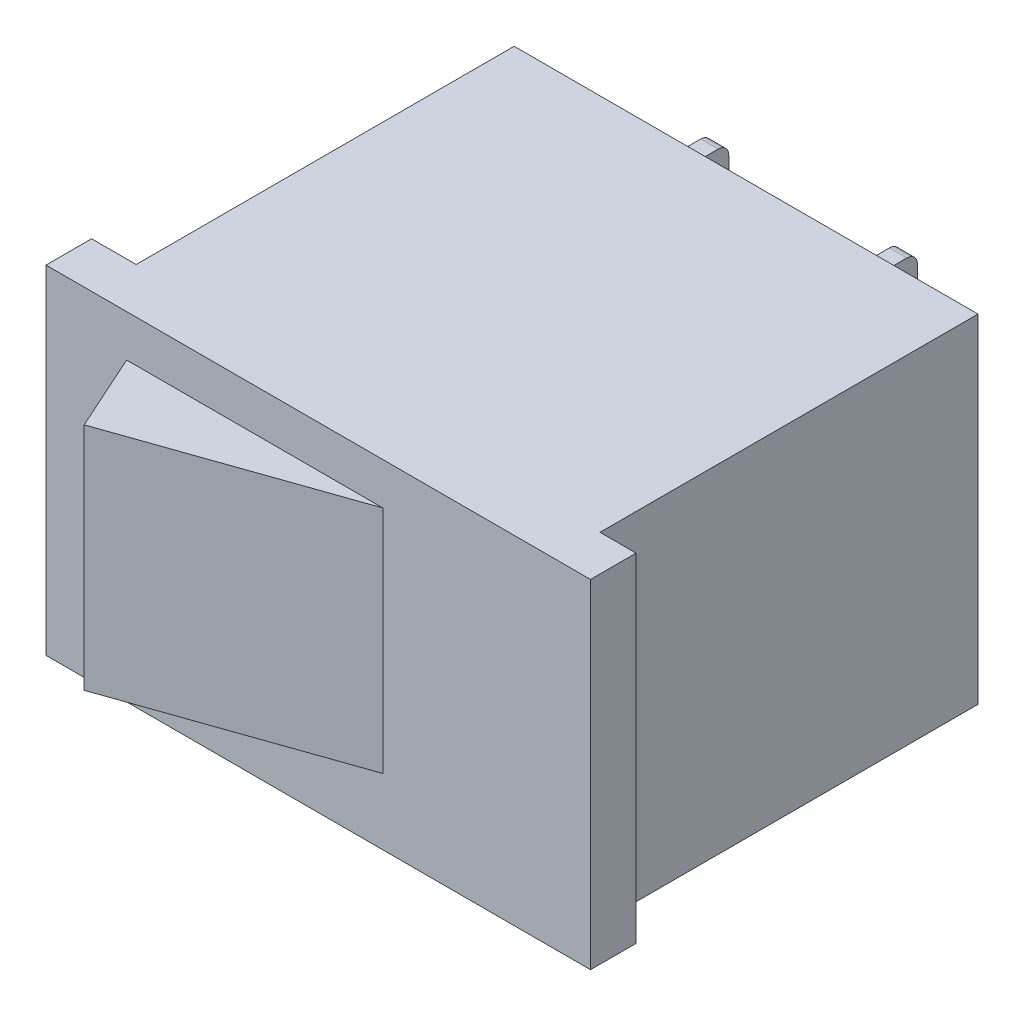
ISO-10303-21;
HEADER;
FILE_DESCRIPTION(('STEP AP214'),'2;1');
FILE_NAME('part.step','',(''),(''),'','','');
FILE_SCHEMA(('AUTOMOTIVE_DESIGN { 1 0 10303 214 1 1 1 1 }'));
ENDSEC;
DATA;
#1=APPLICATION_CONTEXT('core data for automotive mechanical design processes');
#2=APPLICATION_PROTOCOL_DEFINITION('international standard','automotive_design',2000,#1);
#3=PRODUCT_CONTEXT('',#1,'mechanical');
#4=PRODUCT('Part','Part','',(#3));
#5=PRODUCT_RELATED_PRODUCT_CATEGORY('part','',(#4));
#6=PRODUCT_DEFINITION_FORMATION('','',#4);
#7=PRODUCT_DEFINITION_CONTEXT('part definition',#1,'design');
#8=PRODUCT_DEFINITION('design','',#6,#7);
#9=PRODUCT_DEFINITION_SHAPE('','',#8);
#10=(LENGTH_UNIT() NAMED_UNIT(*) SI_UNIT(.MILLI.,.METRE.));
#11=(NAMED_UNIT(*) PLANE_ANGLE_UNIT() SI_UNIT($,.RADIAN.));
#12=(NAMED_UNIT(*) SI_UNIT($,.STERADIAN.) SOLID_ANGLE_UNIT());
#13=UNCERTAINTY_MEASURE_WITH_UNIT(LENGTH_MEASURE(1.E-05),#10,'distance_accuracy_value','');
#14=(GEOMETRIC_REPRESENTATION_CONTEXT(3) GLOBAL_UNCERTAINTY_ASSIGNED_CONTEXT((#13)) GLOBAL_UNIT_ASSIGNED_CONTEXT((#10,
#11,#12)) REPRESENTATION_CONTEXT('',''));
#15=CARTESIAN_POINT('',(0.,0.,0.));
#16=DIRECTION('',(0.,0.,1.));
#17=DIRECTION('',(1.,0.,0.));
#18=AXIS2_PLACEMENT_3D('',#15,#16,#17);
#19=CARTESIAN_POINT('',(152.23999661698,109.43350000042,-5.01892845844));
#20=DIRECTION('',(0.,0.,1.));
#21=DIRECTION('',(0.,-1.,0.));
#22=AXIS2_PLACEMENT_3D('',#19,#20,#21);
#23=PLANE('',#22);
#24=DIRECTION('',(1.,0.,0.));
#25=VECTOR('',#24,1.);
#26=CARTESIAN_POINT('',(163.907021032052,102.351634313093,-5.01892845844));
#27=LINE('',#26,#25);
#28=CARTESIAN_POINT('',(163.907021032052,102.351634313093,-5.01892845844));
#29=VERTEX_POINT('',#28);
#30=CARTESIAN_POINT('',(164.407021032052,102.351634313093,-5.01892845844));
#31=VERTEX_POINT('',#30);
#32=EDGE_CURVE('E342',#29,#31,#27,.T.);
#33=ORIENTED_EDGE('',*,*,#32,.T.);
#34=DIRECTION('',(0.,1.,0.));
#35=VECTOR('',#34,1.);
#36=CARTESIAN_POINT('',(164.407021032052,103.883426971258,-5.01892845844));
#37=LINE('',#36,#35);
#38=CARTESIAN_POINT('',(164.407021032052,103.883426971258,-5.01892845844));
#39=VERTEX_POINT('',#38);
#40=EDGE_CURVE('E340',#31,#39,#37,.T.);
#41=ORIENTED_EDGE('',*,*,#40,.T.);
#42=DIRECTION('',(-1.,0.,0.));
#43=VECTOR('',#42,1.);
#44=CARTESIAN_POINT('',(163.907021032052,103.883426971258,-5.01892845844));
#45=LINE('',#44,#43);
#46=CARTESIAN_POINT('',(163.907021032052,103.883426971258,-5.01892845844));
#47=VERTEX_POINT('',#46);
#48=EDGE_CURVE('E337',#39,#47,#45,.T.);
#49=ORIENTED_EDGE('',*,*,#48,.T.);
#50=DIRECTION('',(0.,-1.,0.));
#51=VECTOR('',#50,1.);
#52=CARTESIAN_POINT('',(163.907021032052,103.883426971258,-5.01892845844));
#53=LINE('',#52,#51);
#54=EDGE_CURVE('E331',#47,#29,#53,.T.);
#55=ORIENTED_EDGE('',*,*,#54,.T.);
#56=EDGE_LOOP('',(#33,#41,#49,#55));
#57=FACE_BOUND('',#56,.T.);
#58=DIRECTION('',(1.,0.,0.));
#59=VECTOR('',#58,1.);
#60=CARTESIAN_POINT('',(195.23999661698,107.740364844211,-5.01892845844));
#61=LINE('',#60,#59);
#62=CARTESIAN_POINT('',(162.795845835652,107.740364844211,-5.01892845844));
#63=VERTEX_POINT('',#62);
#64=CARTESIAN_POINT('',(176.071443274264,107.740364844211,-5.01892845844));
#65=VERTEX_POINT('',#64);
#66=EDGE_CURVE('E368',#63,#65,#61,.T.);
#67=ORIENTED_EDGE('',*,*,#66,.T.);
#68=DIRECTION('',(0.,1.,0.));
#69=VECTOR('',#68,1.);
#70=CARTESIAN_POINT('',(176.071443274264,56.63326000042,-5.01892845844));
#71=LINE('',#70,#69);
#72=CARTESIAN_POINT('',(176.071443274264,98.0658453891069,-5.01892845844));
#73=VERTEX_POINT('',#72);
#74=EDGE_CURVE('E373',#73,#65,#71,.T.);
#75=ORIENTED_EDGE('',*,*,#74,.F.);
#76=DIRECTION('',(-1.,0.,0.));
#77=VECTOR('',#76,1.);
#78=CARTESIAN_POINT('',(195.23999661698,98.0658453891069,-5.01892845844));
#79=LINE('',#78,#77);
#80=CARTESIAN_POINT('',(162.795845835652,98.0658453891069,-5.01892845844));
#81=VERTEX_POINT('',#80);
#82=EDGE_CURVE('E50',#73,#81,#79,.T.);
#83=ORIENTED_EDGE('',*,*,#82,.T.);
#84=DIRECTION('',(0.,1.,0.));
#85=VECTOR('',#84,1.);
#86=CARTESIAN_POINT('',(162.795845835652,56.63326000042,-5.01892845844));
#87=LINE('',#86,#85);
#88=EDGE_CURVE('E11',#81,#63,#87,.T.);
#89=ORIENTED_EDGE('',*,*,#88,.T.);
#90=EDGE_LOOP('',(#67,#75,#83,#89));
#91=FACE_BOUND('',#90,.T.);
#92=DIRECTION('',(-1.,0.,0.));
#93=VECTOR('',#92,1.);
#94=CARTESIAN_POINT('',(169.807021032052,103.883426971258,-5.01892845844));
#95=LINE('',#94,#93);
#96=CARTESIAN_POINT('',(169.807021032052,103.883426971258,-5.01892845844));
#97=VERTEX_POINT('',#96);
#98=CARTESIAN_POINT('',(169.307021032052,103.883426971258,-5.01892845844));
#99=VERTEX_POINT('',#98);
#100=EDGE_CURVE('E62',#97,#99,#95,.T.);
#101=ORIENTED_EDGE('',*,*,#100,.T.);
#102=DIRECTION('',(0.,-1.,0.));
#103=VECTOR('',#102,1.);
#104=CARTESIAN_POINT('',(169.307021032052,103.883426971258,-5.01892845844));
#105=LINE('',#104,#103);
#106=CARTESIAN_POINT('',(169.307021032052,102.351634313093,-5.01892845844));
#107=VERTEX_POINT('',#106);
#108=EDGE_CURVE('E282',#99,#107,#105,.T.);
#109=ORIENTED_EDGE('',*,*,#108,.T.);
#110=DIRECTION('',(1.,0.,0.));
#111=VECTOR('',#110,1.);
#112=CARTESIAN_POINT('',(169.807021032052,102.351634313093,-5.01892845844));
#113=LINE('',#112,#111);
#114=CARTESIAN_POINT('',(169.807021032052,102.351634313093,-5.01892845844));
#115=VERTEX_POINT('',#114);
#116=EDGE_CURVE('E279',#107,#115,#113,.T.);
#117=ORIENTED_EDGE('',*,*,#116,.T.);
#118=DIRECTION('',(0.,1.,0.));
#119=VECTOR('',#118,1.);
#120=CARTESIAN_POINT('',(169.807021032052,103.883426971258,-5.01892845844));
#121=LINE('',#120,#119);
#122=EDGE_CURVE('E58',#115,#97,#121,.T.);
#123=ORIENTED_EDGE('',*,*,#122,.T.);
#124=EDGE_LOOP('',(#101,#109,#117,#123));
#125=FACE_BOUND('',#124,.T.);
#126=ADVANCED_FACE('F42',(#57,#91,#125),#23,.F.);
#127=CARTESIAN_POINT('',(215.443534175473,106.540069400484,10.383601197944));
#128=DIRECTION('',(0.,-1.,0.));
#129=DIRECTION('',(0.,0.,-1.));
#130=AXIS2_PLACEMENT_3D('',#127,#128,#129);
#131=PLANE('',#130);
#132=DIRECTION('',(0.411830588434409,0.,0.911260427336647));
#133=VECTOR('',#132,1.);
#134=CARTESIAN_POINT('',(158.347362330008,106.540069400484,-5.01892845844));
#135=LINE('',#134,#133);
#136=CARTESIAN_POINT('',(163.826190711484,106.540069400484,7.10411347292398));
#137=VERTEX_POINT('',#136);
#138=CARTESIAN_POINT('',(164.826190711484,106.540069400484,9.31682047655098));
#139=VERTEX_POINT('',#138);
#140=EDGE_CURVE('E339',#137,#139,#135,.T.);
#141=ORIENTED_EDGE('',*,*,#140,.T.);
#142=DIRECTION('',(0.944015758001697,0.,-0.329900361691952));
#143=VECTOR('',#142,1.);
#144=CARTESIAN_POINT('',(195.23999661698,106.540069400484,-1.31173681563964));
#145=LINE('',#144,#143);
#146=CARTESIAN_POINT('',(171.157891193871,106.540069400484,7.10411347292399));
#147=VERTEX_POINT('',#146);
#148=EDGE_CURVE('E45',#139,#147,#145,.T.);
#149=ORIENTED_EDGE('',*,*,#148,.T.);
#150=DIRECTION('',(-1.,0.,0.));
#151=VECTOR('',#150,1.);
#152=CARTESIAN_POINT('',(215.443534175473,106.540069400484,7.10411347292398));
#153=LINE('',#152,#151);
#154=EDGE_CURVE('E395',#147,#137,#153,.T.);
#155=ORIENTED_EDGE('',*,*,#154,.T.);
#156=EDGE_LOOP('',(#141,#149,#155));
#157=FACE_BOUND('',#156,.T.);
#158=ADVANCED_FACE('F471',(#157),#131,.F.);
#159=CARTESIAN_POINT('',(163.826190711484,56.63326000042,7.10411347292399));
#160=DIRECTION('',(0.911260427336647,0.,-0.411830588434409));
#161=DIRECTION('',(0.,-1.,0.));
#162=AXIS2_PLACEMENT_3D('',#159,#160,#161);
#163=PLANE('',#162);
#164=ORIENTED_EDGE('',*,*,#140,.F.);
#165=DIRECTION('',(0.,1.,0.));
#166=VECTOR('',#165,1.);
#167=CARTESIAN_POINT('',(163.826190711484,56.63326000042,7.10411347292399));
#168=LINE('',#167,#166);
#169=CARTESIAN_POINT('',(163.826190711484,99.9584788593016,7.10411347292399));
#170=VERTEX_POINT('',#169);
#171=EDGE_CURVE('E348',#170,#137,#168,.T.);
#172=ORIENTED_EDGE('',*,*,#171,.F.);
#173=DIRECTION('',(-0.411830588434409,0.,-0.911260427336647));
#174=VECTOR('',#173,1.);
#175=CARTESIAN_POINT('',(158.347362330008,99.9584788593016,-5.01892845844));
#176=LINE('',#175,#174);
#177=CARTESIAN_POINT('',(164.826190711484,99.9584788593016,9.31682047655098));
#178=VERTEX_POINT('',#177);
#179=EDGE_CURVE('E413',#178,#170,#176,.T.);
#180=ORIENTED_EDGE('',*,*,#179,.F.);
#181=DIRECTION('',(0.,1.,0.));
#182=VECTOR('',#181,1.);
#183=CARTESIAN_POINT('',(164.826190711484,56.63326000042,9.31682047655098));
#184=LINE('',#183,#182);
#185=EDGE_CURVE('E397',#178,#139,#184,.T.);
#186=ORIENTED_EDGE('',*,*,#185,.T.);
#187=EDGE_LOOP('',(#164,#172,#180,#186));
#188=FACE_BOUND('',#187,.T.);
#189=ADVANCED_FACE('F476',(#188),#163,.F.);
#190=CARTESIAN_POINT('',(215.443534175473,99.9584788593016,7.10411347292398));
#191=DIRECTION('',(0.,1.,0.));
#192=DIRECTION('',(1.,0.,0.));
#193=AXIS2_PLACEMENT_3D('',#190,#191,#192);
#194=PLANE('',#193);
#195=DIRECTION('',(-0.944015758001697,0.,0.329900361691952));
#196=VECTOR('',#195,1.);
#197=CARTESIAN_POINT('',(195.23999661698,99.9584788593016,-1.31173681563964));
#198=LINE('',#197,#196);
#199=CARTESIAN_POINT('',(171.157891193871,99.9584788593016,7.10411347292399));
#200=VERTEX_POINT('',#199);
#201=EDGE_CURVE('E410',#200,#178,#198,.T.);
#202=ORIENTED_EDGE('',*,*,#201,.T.);
#203=ORIENTED_EDGE('',*,*,#179,.T.);
#204=DIRECTION('',(-1.,0.,0.));
#205=VECTOR('',#204,1.);
#206=CARTESIAN_POINT('',(215.443534175473,99.9584788593016,7.10411347292398));
#207=LINE('',#206,#205);
#208=EDGE_CURVE('E345',#200,#170,#207,.T.);
#209=ORIENTED_EDGE('',*,*,#208,.F.);
#210=EDGE_LOOP('',(#202,#203,#209));
#211=FACE_BOUND('',#210,.T.);
#212=ADVANCED_FACE('F545',(#211),#194,.F.);
#213=CARTESIAN_POINT('',(164.826190711484,56.63326000042,9.31682047655098));
#214=DIRECTION('',(-0.329900361691952,0.,-0.944015758001697));
#215=DIRECTION('',(-0.944015758001697,0.,0.329900361691952));
#216=AXIS2_PLACEMENT_3D('',#213,#214,#215);
#217=PLANE('',#216);
#218=ORIENTED_EDGE('',*,*,#201,.F.);
#219=DIRECTION('',(0.,1.,0.));
#220=VECTOR('',#219,1.);
#221=CARTESIAN_POINT('',(171.157891193871,56.63326000042,7.10411347292399));
#222=LINE('',#221,#220);
#223=EDGE_CURVE('E378',#200,#147,#222,.T.);
#224=ORIENTED_EDGE('',*,*,#223,.T.);
#225=ORIENTED_EDGE('',*,*,#148,.F.);
#226=ORIENTED_EDGE('',*,*,#185,.F.);
#227=EDGE_LOOP('',(#218,#224,#225,#226));
#228=FACE_BOUND('',#227,.T.);
#229=ADVANCED_FACE('F543',(#228),#217,.F.);
#230=CARTESIAN_POINT('',(162.795845835652,56.63326000042,5.79962091738699));
#231=DIRECTION('',(0.,0.,1.));
#232=DIRECTION('',(0.,-1.,0.));
#233=AXIS2_PLACEMENT_3D('',#230,#231,#232);
#234=PLANE('',#233);
#235=DIRECTION('',(0.,1.,0.));
#236=VECTOR('',#235,1.);
#237=CARTESIAN_POINT('',(161.519288739785,85.43350000042,5.79962091738699));
#238=LINE('',#237,#236);
#239=CARTESIAN_POINT('',(161.519288739785,98.0658453891069,5.79962091738699));
#240=VERTEX_POINT('',#239);
#241=CARTESIAN_POINT('',(161.519288739785,107.740364844211,5.79962091738699));
#242=VERTEX_POINT('',#241);
#243=EDGE_CURVE('E374',#240,#242,#238,.T.);
#244=ORIENTED_EDGE('',*,*,#243,.T.);
#245=DIRECTION('',(1.,0.,0.));
#246=VECTOR('',#245,1.);
#247=CARTESIAN_POINT('',(195.23999661698,107.740364844211,5.79962091738699));
#248=LINE('',#247,#246);
#249=CARTESIAN_POINT('',(162.795845835652,107.740364844211,5.79962091738699));
#250=VERTEX_POINT('',#249);
#251=EDGE_CURVE('E377',#242,#250,#248,.T.);
#252=ORIENTED_EDGE('',*,*,#251,.T.);
#253=DIRECTION('',(0.,1.,0.));
#254=VECTOR('',#253,1.);
#255=CARTESIAN_POINT('',(162.795845835652,56.63326000042,5.79962091738699));
#256=LINE('',#255,#254);
#257=CARTESIAN_POINT('',(162.795845835652,98.0658453891069,5.79962091738699));
#258=VERTEX_POINT('',#257);
#259=EDGE_CURVE('E372',#258,#250,#256,.T.);
#260=ORIENTED_EDGE('',*,*,#259,.F.);
#261=DIRECTION('',(-1.,0.,0.));
#262=VECTOR('',#261,1.);
#263=CARTESIAN_POINT('',(195.23999661698,98.0658453891069,5.79962091738699));
#264=LINE('',#263,#262);
#265=EDGE_CURVE('E402',#258,#240,#264,.T.);
#266=ORIENTED_EDGE('',*,*,#265,.T.);
#267=EDGE_LOOP('',(#244,#252,#260,#266));
#268=FACE_BOUND('',#267,.T.);
#269=ADVANCED_FACE('F452',(#268),#234,.F.);
#270=CARTESIAN_POINT('',(161.519288739785,98.0658453891069,-5.01892845844));
#271=DIRECTION('',(-1.,0.,0.));
#272=DIRECTION('',(0.,1.,0.));
#273=AXIS2_PLACEMENT_3D('',#270,#271,#272);
#274=PLANE('',#273);
#275=ORIENTED_EDGE('',*,*,#243,.F.);
#276=DIRECTION('',(0.,0.,1.));
#277=VECTOR('',#276,1.);
#278=CARTESIAN_POINT('',(161.519288739785,98.0658453891069,-5.01892845844));
#279=LINE('',#278,#277);
#280=CARTESIAN_POINT('',(161.519288739785,98.0658453891069,7.10411347292399));
#281=VERTEX_POINT('',#280);
#282=EDGE_CURVE('E349',#240,#281,#279,.T.);
#283=ORIENTED_EDGE('',*,*,#282,.T.);
#284=DIRECTION('',(0.,-1.,0.));
#285=VECTOR('',#284,1.);
#286=CARTESIAN_POINT('',(161.519288739785,85.43350000042,7.10411347292399));
#287=LINE('',#286,#285);
#288=CARTESIAN_POINT('',(161.519288739785,107.740364844211,7.10411347292399));
#289=VERTEX_POINT('',#288);
#290=EDGE_CURVE('E356',#289,#281,#287,.T.);
#291=ORIENTED_EDGE('',*,*,#290,.F.);
#292=DIRECTION('',(0.,0.,1.));
#293=VECTOR('',#292,1.);
#294=CARTESIAN_POINT('',(161.519288739785,107.740364844211,-5.01892845844));
#295=LINE('',#294,#293);
#296=EDGE_CURVE('E383',#242,#289,#295,.T.);
#297=ORIENTED_EDGE('',*,*,#296,.F.);
#298=EDGE_LOOP('',(#275,#283,#291,#297));
#299=FACE_BOUND('',#298,.T.);
#300=ADVANCED_FACE('F457',(#299),#274,.T.);
#301=CARTESIAN_POINT('',(215.443534175473,106.540069400484,7.10411347292398));
#302=DIRECTION('',(0.,0.,-1.));
#303=DIRECTION('',(-1.,0.,0.));
#304=AXIS2_PLACEMENT_3D('',#301,#302,#303);
#305=PLANE('',#304);
#306=ORIENTED_EDGE('',*,*,#223,.F.);
#307=ORIENTED_EDGE('',*,*,#208,.T.);
#308=ORIENTED_EDGE('',*,*,#171,.T.);
#309=ORIENTED_EDGE('',*,*,#154,.F.);
#310=EDGE_LOOP('',(#306,#307,#308,#309));
#311=FACE_BOUND('',#310,.T.);
#312=DIRECTION('',(0.,1.,0.));
#313=VECTOR('',#312,1.);
#314=CARTESIAN_POINT('',(177.103207009236,85.43350000042,7.10411347292398));
#315=LINE('',#314,#313);
#316=CARTESIAN_POINT('',(177.103207009236,98.0658453891069,7.10411347292398));
#317=VERTEX_POINT('',#316);
#318=CARTESIAN_POINT('',(177.103207009236,107.740364844211,7.10411347292398));
#319=VERTEX_POINT('',#318);
#320=EDGE_CURVE('E362',#317,#319,#315,.T.);
#321=ORIENTED_EDGE('',*,*,#320,.T.);
#322=DIRECTION('',(-1.,0.,0.));
#323=VECTOR('',#322,1.);
#324=CARTESIAN_POINT('',(195.23999661698,107.740364844211,7.10411347292399));
#325=LINE('',#324,#323);
#326=EDGE_CURVE('E365',#319,#289,#325,.T.);
#327=ORIENTED_EDGE('',*,*,#326,.T.);
#328=ORIENTED_EDGE('',*,*,#290,.T.);
#329=DIRECTION('',(1.,0.,0.));
#330=VECTOR('',#329,1.);
#331=CARTESIAN_POINT('',(195.23999661698,98.0658453891069,7.10411347292398));
#332=LINE('',#331,#330);
#333=EDGE_CURVE('E354',#281,#317,#332,.T.);
#334=ORIENTED_EDGE('',*,*,#333,.T.);
#335=EDGE_LOOP('',(#321,#327,#328,#334));
#336=FACE_BOUND('',#335,.T.);
#337=ADVANCED_FACE('F459',(#311,#336),#305,.F.);
#338=CARTESIAN_POINT('',(177.103207009236,108.340364844211,-5.01892845844));
#339=DIRECTION('',(1.,0.,0.));
#340=DIRECTION('',(0.,0.,-1.));
#341=AXIS2_PLACEMENT_3D('',#338,#339,#340);
#342=PLANE('',#341);
#343=DIRECTION('',(0.,-1.,0.));
#344=VECTOR('',#343,1.);
#345=CARTESIAN_POINT('',(177.103207009236,85.43350000042,5.79962091738699));
#346=LINE('',#345,#344);
#347=CARTESIAN_POINT('',(177.103207009236,107.740364844211,5.79962091738699));
#348=VERTEX_POINT('',#347);
#349=CARTESIAN_POINT('',(177.103207009236,98.0658453891069,5.79962091738699));
#350=VERTEX_POINT('',#349);
#351=EDGE_CURVE('E353',#348,#350,#346,.T.);
#352=ORIENTED_EDGE('',*,*,#351,.F.);
#353=DIRECTION('',(0.,0.,1.));
#354=VECTOR('',#353,1.);
#355=CARTESIAN_POINT('',(177.103207009236,107.740364844211,-5.01892845844));
#356=LINE('',#355,#354);
#357=EDGE_CURVE('E350',#348,#319,#356,.T.);
#358=ORIENTED_EDGE('',*,*,#357,.T.);
#359=ORIENTED_EDGE('',*,*,#320,.F.);
#360=DIRECTION('',(0.,0.,1.));
#361=VECTOR('',#360,1.);
#362=CARTESIAN_POINT('',(177.103207009236,98.0658453891069,-5.01892845844));
#363=LINE('',#362,#361);
#364=EDGE_CURVE('E385',#350,#317,#363,.T.);
#365=ORIENTED_EDGE('',*,*,#364,.F.);
#366=EDGE_LOOP('',(#352,#358,#359,#365));
#367=FACE_BOUND('',#366,.T.);
#368=ADVANCED_FACE('F435',(#367),#342,.T.);
#369=CARTESIAN_POINT('',(177.33999661698,56.63326000042,5.79962091738699));
#370=DIRECTION('',(0.,0.,1.));
#371=DIRECTION('',(0.,-1.,0.));
#372=AXIS2_PLACEMENT_3D('',#369,#370,#371);
#373=PLANE('',#372);
#374=ORIENTED_EDGE('',*,*,#351,.T.);
#375=DIRECTION('',(-1.,0.,0.));
#376=VECTOR('',#375,1.);
#377=CARTESIAN_POINT('',(195.23999661698,98.0658453891069,5.79962091738699));
#378=LINE('',#377,#376);
#379=CARTESIAN_POINT('',(176.071443274264,98.0658453891069,5.79962091738699));
#380=VERTEX_POINT('',#379);
#381=EDGE_CURVE('E359',#350,#380,#378,.T.);
#382=ORIENTED_EDGE('',*,*,#381,.T.);
#383=DIRECTION('',(0.,1.,0.));
#384=VECTOR('',#383,1.);
#385=CARTESIAN_POINT('',(176.071443274264,56.63326000042,5.79962091738699));
#386=LINE('',#385,#384);
#387=CARTESIAN_POINT('',(176.071443274264,107.740364844211,5.79962091738699));
#388=VERTEX_POINT('',#387);
#389=EDGE_CURVE('E387',#380,#388,#386,.T.);
#390=ORIENTED_EDGE('',*,*,#389,.T.);
#391=DIRECTION('',(1.,0.,0.));
#392=VECTOR('',#391,1.);
#393=CARTESIAN_POINT('',(195.23999661698,107.740364844211,5.79962091738699));
#394=LINE('',#393,#392);
#395=EDGE_CURVE('E390',#388,#348,#394,.T.);
#396=ORIENTED_EDGE('',*,*,#395,.T.);
#397=EDGE_LOOP('',(#374,#382,#390,#396));
#398=FACE_BOUND('',#397,.T.);
#399=ADVANCED_FACE('F427',(#398),#373,.F.);
#400=CARTESIAN_POINT('',(177.103207009236,98.0658453891069,-5.01892845844));
#401=DIRECTION('',(0.,-1.,0.));
#402=DIRECTION('',(0.,0.,-1.));
#403=AXIS2_PLACEMENT_3D('',#400,#401,#402);
#404=PLANE('',#403);
#405=ORIENTED_EDGE('',*,*,#381,.F.);
#406=ORIENTED_EDGE('',*,*,#364,.T.);
#407=ORIENTED_EDGE('',*,*,#333,.F.);
#408=ORIENTED_EDGE('',*,*,#282,.F.);
#409=ORIENTED_EDGE('',*,*,#265,.F.);
#410=DIRECTION('',(0.,0.,1.));
#411=VECTOR('',#410,1.);
#412=CARTESIAN_POINT('',(162.795845835652,98.0658453891069,-5.01892845844));
#413=LINE('',#412,#411);
#414=EDGE_CURVE('E369',#81,#258,#413,.T.);
#415=ORIENTED_EDGE('',*,*,#414,.F.);
#416=ORIENTED_EDGE('',*,*,#82,.F.);
#417=DIRECTION('',(0.,0.,-1.));
#418=VECTOR('',#417,1.);
#419=CARTESIAN_POINT('',(176.071443274264,98.0658453891069,-5.01892845844));
#420=LINE('',#419,#418);
#421=EDGE_CURVE('E379',#380,#73,#420,.T.);
#422=ORIENTED_EDGE('',*,*,#421,.F.);
#423=EDGE_LOOP('',(#405,#406,#407,#408,#409,#415,#416,#422));
#424=FACE_BOUND('',#423,.T.);
#425=ADVANCED_FACE('F437',(#424),#404,.T.);
#426=CARTESIAN_POINT('',(161.519288739785,107.740364844211,-5.01892845844));
#427=DIRECTION('',(0.,1.,0.));
#428=DIRECTION('',(0.,0.,-1.));
#429=AXIS2_PLACEMENT_3D('',#426,#427,#428);
#430=PLANE('',#429);
#431=ORIENTED_EDGE('',*,*,#251,.F.);
#432=ORIENTED_EDGE('',*,*,#296,.T.);
#433=ORIENTED_EDGE('',*,*,#326,.F.);
#434=ORIENTED_EDGE('',*,*,#357,.F.);
#435=ORIENTED_EDGE('',*,*,#395,.F.);
#436=DIRECTION('',(0.,0.,1.));
#437=VECTOR('',#436,1.);
#438=CARTESIAN_POINT('',(176.071443274264,107.740364844211,-5.01892845844));
#439=LINE('',#438,#437);
#440=EDGE_CURVE('E382',#65,#388,#439,.T.);
#441=ORIENTED_EDGE('',*,*,#440,.F.);
#442=ORIENTED_EDGE('',*,*,#66,.F.);
#443=DIRECTION('',(0.,0.,-1.));
#444=VECTOR('',#443,1.);
#445=CARTESIAN_POINT('',(162.795845835652,107.740364844211,-5.01892845844));
#446=LINE('',#445,#444);
#447=EDGE_CURVE('E391',#250,#63,#446,.T.);
#448=ORIENTED_EDGE('',*,*,#447,.F.);
#449=EDGE_LOOP('',(#431,#432,#433,#434,#435,#441,#442,#448));
#450=FACE_BOUND('',#449,.T.);
#451=ADVANCED_FACE('F431',(#450),#430,.T.);
#452=CARTESIAN_POINT('',(176.071443274264,56.63326000042,5.79962091738699));
#453=DIRECTION('',(-1.,0.,0.));
#454=DIRECTION('',(0.,0.,1.));
#455=AXIS2_PLACEMENT_3D('',#452,#453,#454);
#456=PLANE('',#455);
#457=ORIENTED_EDGE('',*,*,#440,.T.);
#458=ORIENTED_EDGE('',*,*,#389,.F.);
#459=ORIENTED_EDGE('',*,*,#421,.T.);
#460=ORIENTED_EDGE('',*,*,#74,.T.);
#461=EDGE_LOOP('',(#457,#458,#459,#460));
#462=FACE_BOUND('',#461,.T.);
#463=ADVANCED_FACE('F443',(#462),#456,.F.);
#464=CARTESIAN_POINT('',(162.795845835652,56.63326000042,-5.01892845844));
#465=DIRECTION('',(1.,0.,0.));
#466=DIRECTION('',(0.,1.,0.));
#467=AXIS2_PLACEMENT_3D('',#464,#465,#466);
#468=PLANE('',#467);
#469=ORIENTED_EDGE('',*,*,#414,.T.);
#470=ORIENTED_EDGE('',*,*,#259,.T.);
#471=ORIENTED_EDGE('',*,*,#447,.T.);
#472=ORIENTED_EDGE('',*,*,#88,.F.);
#473=EDGE_LOOP('',(#469,#470,#471,#472));
#474=FACE_BOUND('',#473,.T.);
#475=ADVANCED_FACE('F449',(#474),#468,.F.);
#476=CARTESIAN_POINT('',(163.907021032052,102.351634313093,9.31882047655098));
#477=DIRECTION('',(0.,1.,0.));
#478=DIRECTION('',(0.,0.,1.));
#479=AXIS2_PLACEMENT_3D('',#476,#477,#478);
#480=PLANE('',#479);
#481=ORIENTED_EDGE('',*,*,#32,.F.);
#482=DIRECTION('',(0.,0.,-1.));
#483=VECTOR('',#482,1.);
#484=CARTESIAN_POINT('',(163.907021032052,102.351634313093,9.31882047655098));
#485=LINE('',#484,#483);
#486=CARTESIAN_POINT('',(163.907021032052,102.351634313093,-9.24994161748199));
#487=VERTEX_POINT('',#486);
#488=EDGE_CURVE('E329',#29,#487,#485,.T.);
#489=ORIENTED_EDGE('',*,*,#488,.T.);
#490=DIRECTION('',(-1.,0.,0.));
#491=VECTOR('',#490,1.);
#492=CARTESIAN_POINT('',(164.407021032052,102.351634313093,-9.24994161748199));
#493=LINE('',#492,#491);
#494=CARTESIAN_POINT('',(164.407021032052,102.351634313093,-9.24994161748199));
#495=VERTEX_POINT('',#494);
#496=EDGE_CURVE('E294',#495,#487,#493,.T.);
#497=ORIENTED_EDGE('',*,*,#496,.F.);
#498=DIRECTION('',(0.,0.,-1.));
#499=VECTOR('',#498,1.);
#500=CARTESIAN_POINT('',(164.407021032052,102.351634313093,9.31882047655098));
#501=LINE('',#500,#499);
#502=EDGE_CURVE('E332',#31,#495,#501,.T.);
#503=ORIENTED_EDGE('',*,*,#502,.F.);
#504=EDGE_LOOP('',(#481,#489,#497,#503));
#505=FACE_BOUND('',#504,.T.);
#506=ADVANCED_FACE('F493',(#505),#480,.F.);
#507=CARTESIAN_POINT('',(163.907021032052,103.883426971258,9.31882047655098));
#508=DIRECTION('',(1.,0.,0.));
#509=DIRECTION('',(0.,0.,-1.));
#510=AXIS2_PLACEMENT_3D('',#507,#508,#509);
#511=PLANE('',#510);
#512=ORIENTED_EDGE('',*,*,#54,.F.);
#513=DIRECTION('',(0.,0.,-1.));
#514=VECTOR('',#513,1.);
#515=CARTESIAN_POINT('',(163.907021032052,103.883426971258,9.31882047655098));
#516=LINE('',#515,#514);
#517=CARTESIAN_POINT('',(163.907021032052,103.883426971258,-9.24994161748199));
#518=VERTEX_POINT('',#517);
#519=EDGE_CURVE('E297',#47,#518,#516,.T.);
#520=ORIENTED_EDGE('',*,*,#519,.T.);
#521=CARTESIAN_POINT('',(163.907021032052,103.583426971258,-9.24994161748199));
#522=DIRECTION('',(-1.,0.,0.));
#523=DIRECTION('',(0.,-1.,0.));
#524=AXIS2_PLACEMENT_3D('',#521,#522,#523);
#525=CIRCLE('',#524,0.3);
#526=CARTESIAN_POINT('',(163.907021032052,103.583426971258,-9.54994161748199));
#527=VERTEX_POINT('',#526);
#528=EDGE_CURVE('E281',#518,#527,#525,.T.);
#529=ORIENTED_EDGE('',*,*,#528,.T.);
#530=DIRECTION('',(0.,1.,0.));
#531=VECTOR('',#530,1.);
#532=CARTESIAN_POINT('',(163.907021032052,102.351634313093,-9.54994161748199));
#533=LINE('',#532,#531);
#534=CARTESIAN_POINT('',(163.907021032052,102.651634313093,-9.54994161748199));
#535=VERTEX_POINT('',#534);
#536=EDGE_CURVE('E302',#535,#527,#533,.T.);
#537=ORIENTED_EDGE('',*,*,#536,.F.);
#538=CARTESIAN_POINT('',(163.907021032052,102.651634313093,-9.24994161748199));
#539=DIRECTION('',(-1.,0.,0.));
#540=DIRECTION('',(0.,-1.,0.));
#541=AXIS2_PLACEMENT_3D('',#538,#539,#540);
#542=CIRCLE('',#541,0.3);
#543=EDGE_CURVE('E305',#535,#487,#542,.T.);
#544=ORIENTED_EDGE('',*,*,#543,.T.);
#545=ORIENTED_EDGE('',*,*,#488,.F.);
#546=EDGE_LOOP('',(#512,#520,#529,#537,#544,#545));
#547=FACE_BOUND('',#546,.T.);
#548=CARTESIAN_POINT('',(163.907021032052,103.117530642176,-8.6523896122524));
#549=DIRECTION('',(-1.,0.,0.));
#550=DIRECTION('',(0.,-1.,0.));
#551=AXIS2_PLACEMENT_3D('',#548,#549,#550);
#552=CIRCLE('',#551,0.29);
#553=CARTESIAN_POINT('',(163.907021032052,103.407530642176,-8.6523896122524));
#554=VERTEX_POINT('',#553);
#555=CARTESIAN_POINT('',(163.907021032052,102.827530642176,-8.6523896122524));
#556=VERTEX_POINT('',#555);
#557=EDGE_CURVE('E316',#554,#556,#552,.T.);
#558=ORIENTED_EDGE('',*,*,#557,.F.);
#559=CARTESIAN_POINT('',(163.907021032052,103.117530642176,-8.6523896122524));
#560=DIRECTION('',(-1.,0.,0.));
#561=DIRECTION('',(0.,-1.,0.));
#562=AXIS2_PLACEMENT_3D('',#559,#560,#561);
#563=CIRCLE('',#562,0.29);
#564=EDGE_CURVE('E312',#556,#554,#563,.T.);
#565=ORIENTED_EDGE('',*,*,#564,.F.);
#566=EDGE_LOOP('',(#558,#565));
#567=FACE_BOUND('',#566,.T.);
#568=ADVANCED_FACE('F509',(#547,#567),#511,.F.);
#569=CARTESIAN_POINT('',(164.407021032052,103.883426971258,9.31882047655098));
#570=DIRECTION('',(-1.,0.,0.));
#571=DIRECTION('',(0.,0.,1.));
#572=AXIS2_PLACEMENT_3D('',#569,#570,#571);
#573=PLANE('',#572);
#574=ORIENTED_EDGE('',*,*,#40,.F.);
#575=ORIENTED_EDGE('',*,*,#502,.T.);
#576=CARTESIAN_POINT('',(164.407021032052,102.651634313093,-9.24994161748199));
#577=DIRECTION('',(-1.,0.,0.));
#578=DIRECTION('',(0.,-1.,0.));
#579=AXIS2_PLACEMENT_3D('',#576,#577,#578);
#580=CIRCLE('',#579,0.3);
#581=CARTESIAN_POINT('',(164.407021032052,102.651634313093,-9.54994161748199));
#582=VERTEX_POINT('',#581);
#583=EDGE_CURVE('E290',#582,#495,#580,.T.);
#584=ORIENTED_EDGE('',*,*,#583,.F.);
#585=DIRECTION('',(0.,1.,0.));
#586=VECTOR('',#585,1.);
#587=CARTESIAN_POINT('',(164.407021032052,102.351634313093,-9.54994161748199));
#588=LINE('',#587,#586);
#589=CARTESIAN_POINT('',(164.407021032052,103.583426971258,-9.54994161748199));
#590=VERTEX_POINT('',#589);
#591=EDGE_CURVE('E286',#582,#590,#588,.T.);
#592=ORIENTED_EDGE('',*,*,#591,.T.);
#593=CARTESIAN_POINT('',(164.407021032052,103.583426971258,-9.24994161748199));
#594=DIRECTION('',(-1.,0.,0.));
#595=DIRECTION('',(0.,-1.,0.));
#596=AXIS2_PLACEMENT_3D('',#593,#594,#595);
#597=CIRCLE('',#596,0.3);
#598=CARTESIAN_POINT('',(164.407021032052,103.883426971258,-9.24994161748199));
#599=VERTEX_POINT('',#598);
#600=EDGE_CURVE('E289',#599,#590,#597,.T.);
#601=ORIENTED_EDGE('',*,*,#600,.F.);
#602=DIRECTION('',(0.,0.,-1.));
#603=VECTOR('',#602,1.);
#604=CARTESIAN_POINT('',(164.407021032052,103.883426971258,9.31882047655098));
#605=LINE('',#604,#603);
#606=EDGE_CURVE('E334',#39,#599,#605,.T.);
#607=ORIENTED_EDGE('',*,*,#606,.F.);
#608=EDGE_LOOP('',(#574,#575,#584,#592,#601,#607));
#609=FACE_BOUND('',#608,.T.);
#610=CARTESIAN_POINT('',(164.407021032052,103.117530642176,-8.6523896122524));
#611=DIRECTION('',(-1.,0.,0.));
#612=DIRECTION('',(0.,-1.,0.));
#613=AXIS2_PLACEMENT_3D('',#610,#611,#612);
#614=CIRCLE('',#613,0.29);
#615=CARTESIAN_POINT('',(164.407021032052,103.407530642176,-8.6523896122524));
#616=VERTEX_POINT('',#615);
#617=CARTESIAN_POINT('',(164.407021032052,102.827530642176,-8.6523896122524));
#618=VERTEX_POINT('',#617);
#619=EDGE_CURVE('E301',#616,#618,#614,.T.);
#620=ORIENTED_EDGE('',*,*,#619,.T.);
#621=CARTESIAN_POINT('',(164.407021032052,103.117530642176,-8.6523896122524));
#622=DIRECTION('',(-1.,0.,0.));
#623=DIRECTION('',(0.,-1.,0.));
#624=AXIS2_PLACEMENT_3D('',#621,#622,#623);
#625=CIRCLE('',#624,0.29);
#626=EDGE_CURVE('E291',#618,#616,#625,.T.);
#627=ORIENTED_EDGE('',*,*,#626,.T.);
#628=EDGE_LOOP('',(#620,#627));
#629=FACE_BOUND('',#628,.T.);
#630=ADVANCED_FACE('F488',(#609,#629),#573,.F.);
#631=CARTESIAN_POINT('',(163.907021032052,103.883426971258,9.31882047655098));
#632=DIRECTION('',(0.,-1.,0.));
#633=DIRECTION('',(0.,0.,-1.));
#634=AXIS2_PLACEMENT_3D('',#631,#632,#633);
#635=PLANE('',#634);
#636=ORIENTED_EDGE('',*,*,#48,.F.);
#637=ORIENTED_EDGE('',*,*,#606,.T.);
#638=DIRECTION('',(-1.,0.,0.));
#639=VECTOR('',#638,1.);
#640=CARTESIAN_POINT('',(164.407021032052,103.883426971258,-9.24994161748199));
#641=LINE('',#640,#639);
#642=EDGE_CURVE('E293',#599,#518,#641,.T.);
#643=ORIENTED_EDGE('',*,*,#642,.T.);
#644=ORIENTED_EDGE('',*,*,#519,.F.);
#645=EDGE_LOOP('',(#636,#637,#643,#644));
#646=FACE_BOUND('',#645,.T.);
#647=ADVANCED_FACE('F507',(#646),#635,.F.);
#648=CARTESIAN_POINT('',(164.407021032052,102.651634313093,-9.24994161748199));
#649=DIRECTION('',(-1.,0.,0.));
#650=DIRECTION('',(0.,-1.,0.));
#651=AXIS2_PLACEMENT_3D('',#648,#649,#650);
#652=CYLINDRICAL_SURFACE('',#651,0.3);
#653=ORIENTED_EDGE('',*,*,#583,.T.);
#654=ORIENTED_EDGE('',*,*,#496,.T.);
#655=ORIENTED_EDGE('',*,*,#543,.F.);
#656=DIRECTION('',(-1.,0.,0.));
#657=VECTOR('',#656,1.);
#658=CARTESIAN_POINT('',(164.407021032052,102.651634313093,-9.54994161748199));
#659=LINE('',#658,#657);
#660=EDGE_CURVE('E298',#582,#535,#659,.T.);
#661=ORIENTED_EDGE('',*,*,#660,.F.);
#662=EDGE_LOOP('',(#653,#654,#655,#661));
#663=FACE_BOUND('',#662,.T.);
#664=ADVANCED_FACE('F496',(#663),#652,.T.);
#665=CARTESIAN_POINT('',(164.407021032052,102.651634313093,-9.54994161748199));
#666=DIRECTION('',(0.,0.,-1.));
#667=DIRECTION('',(-1.,0.,0.));
#668=AXIS2_PLACEMENT_3D('',#665,#666,#667);
#669=PLANE('',#668);
#670=ORIENTED_EDGE('',*,*,#591,.F.);
#671=ORIENTED_EDGE('',*,*,#660,.T.);
#672=ORIENTED_EDGE('',*,*,#536,.T.);
#673=DIRECTION('',(-1.,0.,0.));
#674=VECTOR('',#673,1.);
#675=CARTESIAN_POINT('',(164.407021032052,103.583426971258,-9.54994161748199));
#676=LINE('',#675,#674);
#677=EDGE_CURVE('E308',#590,#527,#676,.T.);
#678=ORIENTED_EDGE('',*,*,#677,.F.);
#679=EDGE_LOOP('',(#670,#671,#672,#678));
#680=FACE_BOUND('',#679,.T.);
#681=ADVANCED_FACE('F499',(#680),#669,.T.);
#682=CARTESIAN_POINT('',(164.407021032052,103.583426971258,-9.24994161748199));
#683=DIRECTION('',(-1.,0.,0.));
#684=DIRECTION('',(0.,-1.,0.));
#685=AXIS2_PLACEMENT_3D('',#682,#683,#684);
#686=CYLINDRICAL_SURFACE('',#685,0.3);
#687=ORIENTED_EDGE('',*,*,#600,.T.);
#688=ORIENTED_EDGE('',*,*,#677,.T.);
#689=ORIENTED_EDGE('',*,*,#528,.F.);
#690=ORIENTED_EDGE('',*,*,#642,.F.);
#691=EDGE_LOOP('',(#687,#688,#689,#690));
#692=FACE_BOUND('',#691,.T.);
#693=ADVANCED_FACE('F504',(#692),#686,.T.);
#694=CARTESIAN_POINT('',(164.407021032052,103.117530642176,-8.6523896122524));
#695=DIRECTION('',(-1.,0.,0.));
#696=DIRECTION('',(0.,-1.,0.));
#697=AXIS2_PLACEMENT_3D('',#694,#695,#696);
#698=CYLINDRICAL_SURFACE('',#697,0.29);
#699=DIRECTION('',(-1.,0.,0.));
#700=VECTOR('',#699,1.);
#701=CARTESIAN_POINT('',(164.407021032052,102.827530642176,-8.6523896122524));
#702=LINE('',#701,#700);
#703=EDGE_CURVE('E315',#618,#556,#702,.T.);
#704=ORIENTED_EDGE('',*,*,#703,.T.);
#705=ORIENTED_EDGE('',*,*,#564,.T.);
#706=DIRECTION('',(-1.,0.,0.));
#707=VECTOR('',#706,1.);
#708=CARTESIAN_POINT('',(164.407021032052,103.407530642176,-8.6523896122524));
#709=LINE('',#708,#707);
#710=EDGE_CURVE('E299',#616,#554,#709,.T.);
#711=ORIENTED_EDGE('',*,*,#710,.F.);
#712=ORIENTED_EDGE('',*,*,#626,.F.);
#713=EDGE_LOOP('',(#704,#705,#711,#712));
#714=FACE_BOUND('',#713,.T.);
#715=ADVANCED_FACE('F521',(#714),#698,.F.);
#716=CARTESIAN_POINT('',(164.407021032052,103.117530642176,-8.6523896122524));
#717=DIRECTION('',(-1.,0.,0.));
#718=DIRECTION('',(0.,-1.,0.));
#719=AXIS2_PLACEMENT_3D('',#716,#717,#718);
#720=CYLINDRICAL_SURFACE('',#719,0.29);
#721=ORIENTED_EDGE('',*,*,#557,.T.);
#722=ORIENTED_EDGE('',*,*,#703,.F.);
#723=ORIENTED_EDGE('',*,*,#619,.F.);
#724=ORIENTED_EDGE('',*,*,#710,.T.);
#725=EDGE_LOOP('',(#721,#722,#723,#724));
#726=FACE_BOUND('',#725,.T.);
#727=ADVANCED_FACE('F517',(#726),#720,.F.);
#728=CARTESIAN_POINT('',(169.807021032052,103.883426971258,9.31882047655098));
#729=DIRECTION('',(0.,-1.,0.));
#730=DIRECTION('',(0.,0.,-1.));
#731=AXIS2_PLACEMENT_3D('',#728,#729,#730);
#732=PLANE('',#731);
#733=ORIENTED_EDGE('',*,*,#100,.F.);
#734=DIRECTION('',(0.,0.,-1.));
#735=VECTOR('',#734,1.);
#736=CARTESIAN_POINT('',(169.807021032052,103.883426971258,9.31882047655098));
#737=LINE('',#736,#735);
#738=CARTESIAN_POINT('',(169.807021032052,103.883426971258,-9.24994161748199));
#739=VERTEX_POINT('',#738);
#740=EDGE_CURVE('E219',#97,#739,#737,.T.);
#741=ORIENTED_EDGE('',*,*,#740,.T.);
#742=DIRECTION('',(-1.,0.,0.));
#743=VECTOR('',#742,1.);
#744=CARTESIAN_POINT('',(169.807021032052,103.883426971258,-9.24994161748199));
#745=LINE('',#744,#743);
#746=CARTESIAN_POINT('',(169.307021032052,103.883426971258,-9.24994161748199));
#747=VERTEX_POINT('',#746);
#748=EDGE_CURVE('E223',#739,#747,#745,.T.);
#749=ORIENTED_EDGE('',*,*,#748,.T.);
#750=DIRECTION('',(0.,0.,-1.));
#751=VECTOR('',#750,1.);
#752=CARTESIAN_POINT('',(169.307021032052,103.883426971258,9.31882047655098));
#753=LINE('',#752,#751);
#754=EDGE_CURVE('E227',#99,#747,#753,.T.);
#755=ORIENTED_EDGE('',*,*,#754,.F.);
#756=EDGE_LOOP('',(#733,#741,#749,#755));
#757=FACE_BOUND('',#756,.T.);
#758=ADVANCED_FACE('F221',(#757),#732,.F.);
#759=CARTESIAN_POINT('',(169.807021032052,103.883426971258,9.31882047655098));
#760=DIRECTION('',(-1.,0.,0.));
#761=DIRECTION('',(0.,0.,1.));
#762=AXIS2_PLACEMENT_3D('',#759,#760,#761);
#763=PLANE('',#762);
#764=ORIENTED_EDGE('',*,*,#122,.F.);
#765=DIRECTION('',(0.,0.,-1.));
#766=VECTOR('',#765,1.);
#767=CARTESIAN_POINT('',(169.807021032052,102.351634313093,9.31882047655098));
#768=LINE('',#767,#766);
#769=CARTESIAN_POINT('',(169.807021032052,102.351634313093,-9.24994161748199));
#770=VERTEX_POINT('',#769);
#771=EDGE_CURVE('E236',#115,#770,#768,.T.);
#772=ORIENTED_EDGE('',*,*,#771,.T.);
#773=CARTESIAN_POINT('',(169.807021032052,102.651634313093,-9.24994161748199));
#774=DIRECTION('',(-1.,0.,0.));
#775=DIRECTION('',(0.,-1.,0.));
#776=AXIS2_PLACEMENT_3D('',#773,#774,#775);
#777=CIRCLE('',#776,0.3);
#778=CARTESIAN_POINT('',(169.807021032052,102.651634313093,-9.54994161748199));
#779=VERTEX_POINT('',#778);
#780=EDGE_CURVE('E264',#779,#770,#777,.T.);
#781=ORIENTED_EDGE('',*,*,#780,.F.);
#782=DIRECTION('',(0.,1.,0.));
#783=VECTOR('',#782,1.);
#784=CARTESIAN_POINT('',(169.807021032052,102.351634313093,-9.54994161748199));
#785=LINE('',#784,#783);
#786=CARTESIAN_POINT('',(169.807021032052,103.583426971258,-9.54994161748199));
#787=VERTEX_POINT('',#786);
#788=EDGE_CURVE('E237',#779,#787,#785,.T.);
#789=ORIENTED_EDGE('',*,*,#788,.T.);
#790=CARTESIAN_POINT('',(169.807021032052,103.583426971258,-9.24994161748199));
#791=DIRECTION('',(-1.,0.,0.));
#792=DIRECTION('',(0.,-1.,0.));
#793=AXIS2_PLACEMENT_3D('',#790,#791,#792);
#794=CIRCLE('',#793,0.3);
#795=EDGE_CURVE('E232',#739,#787,#794,.T.);
#796=ORIENTED_EDGE('',*,*,#795,.F.);
#797=ORIENTED_EDGE('',*,*,#740,.F.);
#798=EDGE_LOOP('',(#764,#772,#781,#789,#796,#797));
#799=FACE_BOUND('',#798,.T.);
#800=CARTESIAN_POINT('',(169.807021032052,103.117530642176,-8.6523896122524));
#801=DIRECTION('',(-1.,0.,0.));
#802=DIRECTION('',(0.,-1.,0.));
#803=AXIS2_PLACEMENT_3D('',#800,#801,#802);
#804=CIRCLE('',#803,0.29);
#805=CARTESIAN_POINT('',(169.807021032052,103.407530642176,-8.6523896122524));
#806=VERTEX_POINT('',#805);
#807=CARTESIAN_POINT('',(169.807021032052,102.827530642176,-8.6523896122524));
#808=VERTEX_POINT('',#807);
#809=EDGE_CURVE('E251',#806,#808,#804,.T.);
#810=ORIENTED_EDGE('',*,*,#809,.T.);
#811=CARTESIAN_POINT('',(169.807021032052,103.117530642176,-8.6523896122524));
#812=DIRECTION('',(-1.,0.,0.));
#813=DIRECTION('',(0.,-1.,0.));
#814=AXIS2_PLACEMENT_3D('',#811,#812,#813);
#815=CIRCLE('',#814,0.29);
#816=EDGE_CURVE('E253',#808,#806,#815,.T.);
#817=ORIENTED_EDGE('',*,*,#816,.T.);
#818=EDGE_LOOP('',(#810,#817));
#819=FACE_BOUND('',#818,.T.);
#820=ADVANCED_FACE('F239',(#799,#819),#763,.F.);
#821=CARTESIAN_POINT('',(169.307021032052,103.883426971258,9.31882047655098));
#822=DIRECTION('',(1.,0.,0.));
#823=DIRECTION('',(0.,0.,-1.));
#824=AXIS2_PLACEMENT_3D('',#821,#822,#823);
#825=PLANE('',#824);
#826=ORIENTED_EDGE('',*,*,#108,.F.);
#827=ORIENTED_EDGE('',*,*,#754,.T.);
#828=CARTESIAN_POINT('',(169.307021032052,103.583426971258,-9.24994161748199));
#829=DIRECTION('',(-1.,0.,0.));
#830=DIRECTION('',(0.,-1.,0.));
#831=AXIS2_PLACEMENT_3D('',#828,#829,#830);
#832=CIRCLE('',#831,0.3);
#833=CARTESIAN_POINT('',(169.307021032052,103.583426971258,-9.54994161748199));
#834=VERTEX_POINT('',#833);
#835=EDGE_CURVE('E235',#747,#834,#832,.T.);
#836=ORIENTED_EDGE('',*,*,#835,.T.);
#837=DIRECTION('',(0.,1.,0.));
#838=VECTOR('',#837,1.);
#839=CARTESIAN_POINT('',(169.307021032052,102.351634313093,-9.54994161748199));
#840=LINE('',#839,#838);
#841=CARTESIAN_POINT('',(169.307021032052,102.651634313093,-9.54994161748199));
#842=VERTEX_POINT('',#841);
#843=EDGE_CURVE('E269',#842,#834,#840,.T.);
#844=ORIENTED_EDGE('',*,*,#843,.F.);
#845=CARTESIAN_POINT('',(169.307021032052,102.651634313093,-9.24994161748199));
#846=DIRECTION('',(-1.,0.,0.));
#847=DIRECTION('',(0.,-1.,0.));
#848=AXIS2_PLACEMENT_3D('',#845,#846,#847);
#849=CIRCLE('',#848,0.3);
#850=CARTESIAN_POINT('',(169.307021032052,102.351634313093,-9.24994161748199));
#851=VERTEX_POINT('',#850);
#852=EDGE_CURVE('E254',#842,#851,#849,.T.);
#853=ORIENTED_EDGE('',*,*,#852,.T.);
#854=DIRECTION('',(0.,0.,-1.));
#855=VECTOR('',#854,1.);
#856=CARTESIAN_POINT('',(169.307021032052,102.351634313093,9.31882047655098));
#857=LINE('',#856,#855);
#858=EDGE_CURVE('E276',#107,#851,#857,.T.);
#859=ORIENTED_EDGE('',*,*,#858,.F.);
#860=EDGE_LOOP('',(#826,#827,#836,#844,#853,#859));
#861=FACE_BOUND('',#860,.T.);
#862=CARTESIAN_POINT('',(169.307021032052,103.117530642176,-8.6523896122524));
#863=DIRECTION('',(-1.,0.,0.));
#864=DIRECTION('',(0.,-1.,0.));
#865=AXIS2_PLACEMENT_3D('',#862,#863,#864);
#866=CIRCLE('',#865,0.29);
#867=CARTESIAN_POINT('',(169.307021032052,103.407530642176,-8.6523896122524));
#868=VERTEX_POINT('',#867);
#869=CARTESIAN_POINT('',(169.307021032052,102.827530642176,-8.6523896122524));
#870=VERTEX_POINT('',#869);
#871=EDGE_CURVE('E258',#868,#870,#866,.T.);
#872=ORIENTED_EDGE('',*,*,#871,.F.);
#873=CARTESIAN_POINT('',(169.307021032052,103.117530642176,-8.6523896122524));
#874=DIRECTION('',(-1.,0.,0.));
#875=DIRECTION('',(0.,-1.,0.));
#876=AXIS2_PLACEMENT_3D('',#873,#874,#875);
#877=CIRCLE('',#876,0.29);
#878=EDGE_CURVE('E249',#870,#868,#877,.T.);
#879=ORIENTED_EDGE('',*,*,#878,.F.);
#880=EDGE_LOOP('',(#872,#879));
#881=FACE_BOUND('',#880,.T.);
#882=ADVANCED_FACE('F714',(#861,#881),#825,.F.);
#883=CARTESIAN_POINT('',(169.807021032052,102.351634313093,9.31882047655098));
#884=DIRECTION('',(0.,1.,0.));
#885=DIRECTION('',(0.,0.,1.));
#886=AXIS2_PLACEMENT_3D('',#883,#884,#885);
#887=PLANE('',#886);
#888=ORIENTED_EDGE('',*,*,#116,.F.);
#889=ORIENTED_EDGE('',*,*,#858,.T.);
#890=DIRECTION('',(-1.,0.,0.));
#891=VECTOR('',#890,1.);
#892=CARTESIAN_POINT('',(169.807021032052,102.351634313093,-9.24994161748199));
#893=LINE('',#892,#891);
#894=EDGE_CURVE('E260',#770,#851,#893,.T.);
#895=ORIENTED_EDGE('',*,*,#894,.F.);
#896=ORIENTED_EDGE('',*,*,#771,.F.);
#897=EDGE_LOOP('',(#888,#889,#895,#896));
#898=FACE_BOUND('',#897,.T.);
#899=ADVANCED_FACE('F698',(#898),#887,.F.);
#900=CARTESIAN_POINT('',(169.807021032052,103.583426971258,-9.24994161748199));
#901=DIRECTION('',(-1.,0.,0.));
#902=DIRECTION('',(0.,-1.,0.));
#903=AXIS2_PLACEMENT_3D('',#900,#901,#902);
#904=CYLINDRICAL_SURFACE('',#903,0.3);
#905=ORIENTED_EDGE('',*,*,#795,.T.);
#906=DIRECTION('',(-1.,0.,0.));
#907=VECTOR('',#906,1.);
#908=CARTESIAN_POINT('',(169.807021032052,103.583426971258,-9.54994161748199));
#909=LINE('',#908,#907);
#910=EDGE_CURVE('E243',#787,#834,#909,.T.);
#911=ORIENTED_EDGE('',*,*,#910,.T.);
#912=ORIENTED_EDGE('',*,*,#835,.F.);
#913=ORIENTED_EDGE('',*,*,#748,.F.);
#914=EDGE_LOOP('',(#905,#911,#912,#913));
#915=FACE_BOUND('',#914,.T.);
#916=ADVANCED_FACE('F231',(#915),#904,.T.);
#917=CARTESIAN_POINT('',(169.807021032052,102.651634313093,-9.54994161748199));
#918=DIRECTION('',(0.,0.,-1.));
#919=DIRECTION('',(-1.,0.,0.));
#920=AXIS2_PLACEMENT_3D('',#917,#918,#919);
#921=PLANE('',#920);
#922=ORIENTED_EDGE('',*,*,#788,.F.);
#923=DIRECTION('',(-1.,0.,0.));
#924=VECTOR('',#923,1.);
#925=CARTESIAN_POINT('',(169.807021032052,102.651634313093,-9.54994161748199));
#926=LINE('',#925,#924);
#927=EDGE_CURVE('E245',#779,#842,#926,.T.);
#928=ORIENTED_EDGE('',*,*,#927,.T.);
#929=ORIENTED_EDGE('',*,*,#843,.T.);
#930=ORIENTED_EDGE('',*,*,#910,.F.);
#931=EDGE_LOOP('',(#922,#928,#929,#930));
#932=FACE_BOUND('',#931,.T.);
#933=ADVANCED_FACE('F742',(#932),#921,.T.);
#934=CARTESIAN_POINT('',(169.807021032052,102.651634313093,-9.24994161748199));
#935=DIRECTION('',(-1.,0.,0.));
#936=DIRECTION('',(0.,-1.,0.));
#937=AXIS2_PLACEMENT_3D('',#934,#935,#936);
#938=CYLINDRICAL_SURFACE('',#937,0.3);
#939=ORIENTED_EDGE('',*,*,#780,.T.);
#940=ORIENTED_EDGE('',*,*,#894,.T.);
#941=ORIENTED_EDGE('',*,*,#852,.F.);
#942=ORIENTED_EDGE('',*,*,#927,.F.);
#943=EDGE_LOOP('',(#939,#940,#941,#942));
#944=FACE_BOUND('',#943,.T.);
#945=ADVANCED_FACE('F751',(#944),#938,.T.);
#946=CARTESIAN_POINT('',(169.807021032052,103.117530642176,-8.6523896122524));
#947=DIRECTION('',(-1.,0.,0.));
#948=DIRECTION('',(0.,-1.,0.));
#949=AXIS2_PLACEMENT_3D('',#946,#947,#948);
#950=CYLINDRICAL_SURFACE('',#949,0.29);
#951=DIRECTION('',(-1.,0.,0.));
#952=VECTOR('',#951,1.);
#953=CARTESIAN_POINT('',(169.807021032052,102.827530642176,-8.6523896122524));
#954=LINE('',#953,#952);
#955=EDGE_CURVE('E263',#808,#870,#954,.T.);
#956=ORIENTED_EDGE('',*,*,#955,.T.);
#957=ORIENTED_EDGE('',*,*,#878,.T.);
#958=DIRECTION('',(-1.,0.,0.));
#959=VECTOR('',#958,1.);
#960=CARTESIAN_POINT('',(169.807021032052,103.407530642176,-8.6523896122524));
#961=LINE('',#960,#959);
#962=EDGE_CURVE('E256',#806,#868,#961,.T.);
#963=ORIENTED_EDGE('',*,*,#962,.F.);
#964=ORIENTED_EDGE('',*,*,#816,.F.);
#965=EDGE_LOOP('',(#956,#957,#963,#964));
#966=FACE_BOUND('',#965,.T.);
#967=ADVANCED_FACE('F761',(#966),#950,.F.);
#968=CARTESIAN_POINT('',(169.807021032052,103.117530642176,-8.6523896122524));
#969=DIRECTION('',(-1.,0.,0.));
#970=DIRECTION('',(0.,-1.,0.));
#971=AXIS2_PLACEMENT_3D('',#968,#969,#970);
#972=CYLINDRICAL_SURFACE('',#971,0.29);
#973=ORIENTED_EDGE('',*,*,#871,.T.);
#974=ORIENTED_EDGE('',*,*,#955,.F.);
#975=ORIENTED_EDGE('',*,*,#809,.F.);
#976=ORIENTED_EDGE('',*,*,#962,.T.);
#977=EDGE_LOOP('',(#973,#974,#975,#976));
#978=FACE_BOUND('',#977,.T.);
#979=ADVANCED_FACE('F771',(#978),#972,.F.);
#980=CLOSED_SHELL('',(#126,#158,#189,#212,#229,#269,#300,#337,#368,#399,#425,#451,#463,#475,
#506,#568,#630,#647,#664,#681,#693,#715,#727,#758,#820,#882,#899,#916,#933,#945,#967,#979));
#981=MANIFOLD_SOLID_BREP('B2',#980);
#982=ADVANCED_BREP_SHAPE_REPRESENTATION('',(#18,#981),#14);
#983=SHAPE_DEFINITION_REPRESENTATION(#9,#982);
ENDSEC;
END-ISO-10303-21;
